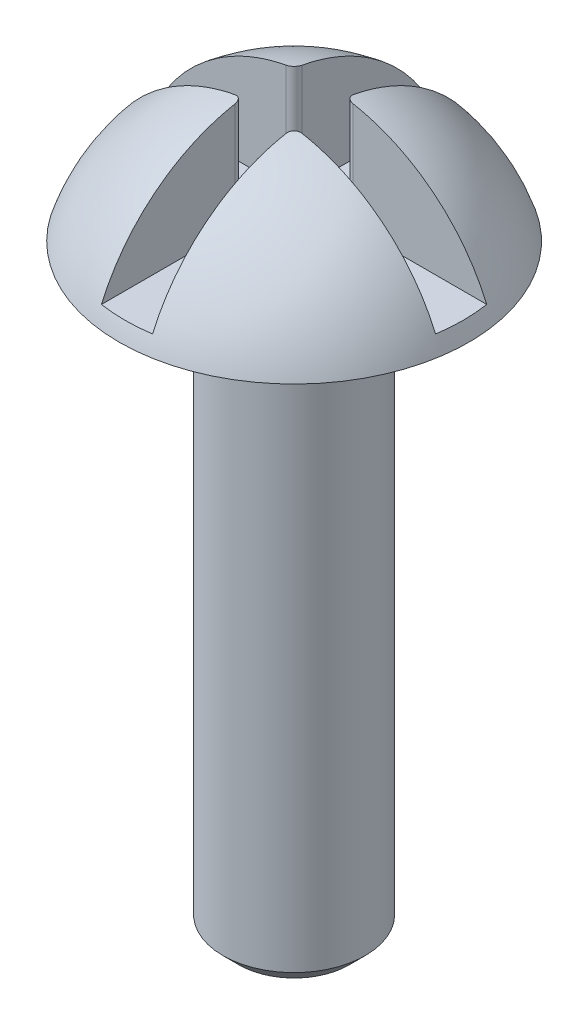
ISO-10303-21;
HEADER;
FILE_DESCRIPTION(('STEP AP214'),'2;1');
FILE_NAME('part.step','',(''),(''),'','','');
FILE_SCHEMA(('AUTOMOTIVE_DESIGN { 1 0 10303 214 1 1 1 1 }'));
ENDSEC;
DATA;
#1=APPLICATION_CONTEXT('core data for automotive mechanical design processes');
#2=APPLICATION_PROTOCOL_DEFINITION('international standard','automotive_design',2000,#1);
#3=PRODUCT_CONTEXT('',#1,'mechanical');
#4=PRODUCT('Part','Part','',(#3));
#5=PRODUCT_RELATED_PRODUCT_CATEGORY('part','',(#4));
#6=PRODUCT_DEFINITION_FORMATION('','',#4);
#7=PRODUCT_DEFINITION_CONTEXT('part definition',#1,'design');
#8=PRODUCT_DEFINITION('design','',#6,#7);
#9=PRODUCT_DEFINITION_SHAPE('','',#8);
#10=(LENGTH_UNIT() NAMED_UNIT(*) SI_UNIT(.MILLI.,.METRE.));
#11=(NAMED_UNIT(*) PLANE_ANGLE_UNIT() SI_UNIT($,.RADIAN.));
#12=(NAMED_UNIT(*) SI_UNIT($,.STERADIAN.) SOLID_ANGLE_UNIT());
#13=UNCERTAINTY_MEASURE_WITH_UNIT(LENGTH_MEASURE(1.E-05),#10,'distance_accuracy_value','');
#14=(GEOMETRIC_REPRESENTATION_CONTEXT(3) GLOBAL_UNCERTAINTY_ASSIGNED_CONTEXT((#13)) GLOBAL_UNIT_ASSIGNED_CONTEXT((#10,
#11,#12)) REPRESENTATION_CONTEXT('',''));
#15=CARTESIAN_POINT('',(0.,0.,0.));
#16=DIRECTION('',(0.,0.,1.));
#17=DIRECTION('',(1.,0.,0.));
#18=AXIS2_PLACEMENT_3D('',#15,#16,#17);
#19=CARTESIAN_POINT('',(0.,-0.8874521875,0.));
#20=DIRECTION('',(0.,1.,0.));
#21=DIRECTION('',(0.,0.,-1.));
#22=AXIS2_PLACEMENT_3D('',#19,#20,#21);
#23=SPHERICAL_SURFACE('',#22,2.9194521875);
#24=CARTESIAN_POINT('',(0.,0.,0.));
#25=DIRECTION('',(0.,1.,0.));
#26=DIRECTION('',(0.,0.,1.));
#27=AXIS2_PLACEMENT_3D('',#24,#25,#26);
#28=CIRCLE('',#27,2.7813);
#29=CARTESIAN_POINT('',(0.,0.,2.7813));
#30=VERTEX_POINT('',#29);
#31=EDGE_CURVE('E141',#30,#30,#28,.T.);
#32=ORIENTED_EDGE('',*,*,#31,.T.);
#33=EDGE_LOOP('',(#32));
#34=FACE_BOUND('',#33,.T.);
#35=CARTESIAN_POINT('',(0.,-0.8874521875,0.4064));
#36=DIRECTION('',(0.,0.,-1.));
#37=DIRECTION('',(-1.,0.,0.));
#38=AXIS2_PLACEMENT_3D('',#35,#36,#37);
#39=CIRCLE('',#38,2.89102751891063);
#40=CARTESIAN_POINT('',(0.5334,1.95394263812676,0.4064));
#41=VERTEX_POINT('',#40);
#42=CARTESIAN_POINT('',(2.65614890748806,0.254,0.4064));
#43=VERTEX_POINT('',#42);
#44=EDGE_CURVE('E130',#41,#43,#39,.T.);
#45=ORIENTED_EDGE('',*,*,#44,.F.);
#46=CARTESIAN_POINT('',(0.5334,1.95394263812676,0.4064));
#47=CARTESIAN_POINT('',(0.526429818175139,1.95525229722327,0.406393656141367));
#48=CARTESIAN_POINT('',(0.519437835446964,1.95645509605652,0.406973594128656));
#49=CARTESIAN_POINT('',(0.505606235655716,1.95861553609979,0.4092821138562));
#50=CARTESIAN_POINT('',(0.498766646008504,1.95957313351748,0.411010900579816));
#51=CARTESIAN_POINT('',(0.485430256638656,1.96121224794666,0.41559599247346));
#52=CARTESIAN_POINT('',(0.478933887553856,1.96189342496913,0.418453677685523));
#53=CARTESIAN_POINT('',(0.466492205552098,1.96295524916309,0.425222198161783));
#54=CARTESIAN_POINT('',(0.460546593915372,1.96333606009944,0.429132457981764));
#55=CARTESIAN_POINT('',(0.449486927445761,1.96378044826487,0.437816878775803));
#56=CARTESIAN_POINT('',(0.444359620352882,1.96384971613864,0.442573878351436));
#57=CARTESIAN_POINT('',(0.434956144691681,1.96368421809729,0.45286200159492));
#58=CARTESIAN_POINT('',(0.430680051299517,1.96344942534235,0.458393193563276));
#59=CARTESIAN_POINT('',(0.423132521628344,1.96268707574739,0.470014757316168));
#60=CARTESIAN_POINT('',(0.419852633333455,1.96216209494732,0.47609982079818));
#61=CARTESIAN_POINT('',(0.414329348110143,1.9608378635328,0.488695976120198));
#62=CARTESIAN_POINT('',(0.412085879160701,1.96003863198283,0.495207038321548));
#63=CARTESIAN_POINT('',(0.409056788031691,1.95839420105987,0.507011870443117));
#64=CARTESIAN_POINT('',(0.4080593321899,1.95759753777458,0.51225938370448));
#65=CARTESIAN_POINT('',(0.406730640863846,1.95586838945596,0.522808202103091));
#66=CARTESIAN_POINT('',(0.406398441009912,1.9549361031323,0.528109418162684));
#67=CARTESIAN_POINT('',(0.406399999999747,1.95394263812875,0.533400000000212));
#68=B_SPLINE_CURVE_WITH_KNOTS('',3,(#46,#47,#48,#49,#50,#51,#52,#53,#54,#55,#56,#57,#58,#59,#60,
#61,#62,#63,#64,#65,#66,#67),.UNSPECIFIED.,.F.,.F.,(4,2,2,2,2,2,2,2,2,2,4),(0.,
0.0212545383082465,0.0425128699765531,0.0637972700923001,0.0850700575426839,0.105952655327571,
0.126837096571577,0.147539053766297,0.168239572160783,0.184399511119075,0.200536007268686),.UNSPECIFIED.);
#69=CARTESIAN_POINT('',(0.4064,1.95394263812676,0.533399999999999));
#70=VERTEX_POINT('',#69);
#71=EDGE_CURVE('E199',#41,#70,#68,.T.);
#72=ORIENTED_EDGE('',*,*,#71,.T.);
#73=CARTESIAN_POINT('',(0.4064,-0.8874521875,0.));
#74=DIRECTION('',(-1.,0.,0.));
#75=DIRECTION('',(0.,0.,1.));
#76=AXIS2_PLACEMENT_3D('',#73,#74,#75);
#77=CIRCLE('',#76,2.89102751891063);
#78=CARTESIAN_POINT('',(0.4064,0.254,2.65614890748806));
#79=VERTEX_POINT('',#78);
#80=EDGE_CURVE('E157',#79,#70,#77,.T.);
#81=ORIENTED_EDGE('',*,*,#80,.F.);
#82=CARTESIAN_POINT('',(0.,0.254,0.));
#83=DIRECTION('',(0.,-1.,0.));
#84=DIRECTION('',(0.,0.,-1.));
#85=AXIS2_PLACEMENT_3D('',#82,#83,#84);
#86=CIRCLE('',#85,2.68705935527111);
#87=CARTESIAN_POINT('',(-0.4064,0.254,2.65614890748806));
#88=VERTEX_POINT('',#87);
#89=EDGE_CURVE('E133',#79,#88,#86,.T.);
#90=ORIENTED_EDGE('',*,*,#89,.T.);
#91=CARTESIAN_POINT('',(-0.4064,-0.8874521875,0.));
#92=DIRECTION('',(1.,0.,0.));
#93=DIRECTION('',(0.,0.,-1.));
#94=AXIS2_PLACEMENT_3D('',#91,#92,#93);
#95=CIRCLE('',#94,2.89102751891063);
#96=CARTESIAN_POINT('',(-0.4064,1.95394263812676,0.5334));
#97=VERTEX_POINT('',#96);
#98=EDGE_CURVE('E163',#97,#88,#95,.T.);
#99=ORIENTED_EDGE('',*,*,#98,.F.);
#100=CARTESIAN_POINT('',(-0.4064,1.95394263812676,0.5334));
#101=CARTESIAN_POINT('',(-0.406393656141367,1.95525229722327,0.526429818175139));
#102=CARTESIAN_POINT('',(-0.406973594128656,1.95645509605652,0.519437835446964));
#103=CARTESIAN_POINT('',(-0.4092821138562,1.95861553609979,0.505606235655716));
#104=CARTESIAN_POINT('',(-0.411010900579817,1.95957313351748,0.498766646008504));
#105=CARTESIAN_POINT('',(-0.41559599247346,1.96121224794666,0.485430256638656));
#106=CARTESIAN_POINT('',(-0.418453677685524,1.96189342496913,0.478933887553856));
#107=CARTESIAN_POINT('',(-0.425222198161783,1.96295524916309,0.466492205552098));
#108=CARTESIAN_POINT('',(-0.429132457981765,1.96333606009944,0.460546593915372));
#109=CARTESIAN_POINT('',(-0.437816878775803,1.96378044826487,0.449486927445761));
#110=CARTESIAN_POINT('',(-0.442573878351437,1.96384971613864,0.444359620352882));
#111=CARTESIAN_POINT('',(-0.452862001594921,1.96368421809729,0.434956144691681));
#112=CARTESIAN_POINT('',(-0.458393193563277,1.96344942534234,0.430680051299517));
#113=CARTESIAN_POINT('',(-0.470014757316169,1.96268707574739,0.423132521628344));
#114=CARTESIAN_POINT('',(-0.47609982079818,1.96216209494732,0.419852633333455));
#115=CARTESIAN_POINT('',(-0.488695976120198,1.9608378635328,0.414329348110143));
#116=CARTESIAN_POINT('',(-0.495207038321549,1.96003863198283,0.4120858791607));
#117=CARTESIAN_POINT('',(-0.507011870443117,1.95839420105987,0.409056788031691));
#118=CARTESIAN_POINT('',(-0.51225938370448,1.95759753777458,0.4080593321899));
#119=CARTESIAN_POINT('',(-0.522808202103091,1.95586838945596,0.406730640863846));
#120=CARTESIAN_POINT('',(-0.528109418162684,1.9549361031323,0.406398441009912));
#121=CARTESIAN_POINT('',(-0.533400000000212,1.95394263812875,0.406399999999747));
#122=B_SPLINE_CURVE_WITH_KNOTS('',3,(#100,#101,#102,#103,#104,#105,#106,#107,#108,#109,#110,
#111,#112,#113,#114,#115,#116,#117,#118,#119,#120,#121),.UNSPECIFIED.,.F.,.F.,(4,2,2,2,2,2,2,2,
2,2,4),(0.,0.0212545383082466,0.0425128699765532,0.0637972700923003,0.0850700575426841,
0.105952655327572,0.126837096571577,0.147539053766297,0.168239572160783,0.184399511119075,
0.200536007268686),.UNSPECIFIED.);
#123=CARTESIAN_POINT('',(-0.5334,1.95394263812676,0.4064));
#124=VERTEX_POINT('',#123);
#125=EDGE_CURVE('E177',#97,#124,#122,.T.);
#126=ORIENTED_EDGE('',*,*,#125,.T.);
#127=CARTESIAN_POINT('',(0.,-0.8874521875,0.4064));
#128=DIRECTION('',(0.,0.,-1.));
#129=DIRECTION('',(-1.,0.,0.));
#130=AXIS2_PLACEMENT_3D('',#127,#128,#129);
#131=CIRCLE('',#130,2.89102751891063);
#132=CARTESIAN_POINT('',(-2.65614890748806,0.254,0.4064));
#133=VERTEX_POINT('',#132);
#134=EDGE_CURVE('E160',#133,#124,#131,.T.);
#135=ORIENTED_EDGE('',*,*,#134,.F.);
#136=CARTESIAN_POINT('',(-2.65614890748806,0.254,-0.4064));
#137=VERTEX_POINT('',#136);
#138=EDGE_CURVE('E131',#133,#137,#86,.T.);
#139=ORIENTED_EDGE('',*,*,#138,.T.);
#140=CARTESIAN_POINT('',(0.,-0.8874521875,-0.406399999999999));
#141=DIRECTION('',(0.,0.,1.));
#142=DIRECTION('',(1.,0.,0.));
#143=AXIS2_PLACEMENT_3D('',#140,#141,#142);
#144=CIRCLE('',#143,2.89102751891063);
#145=CARTESIAN_POINT('',(-0.5334,1.95394263812676,-0.406399999999999));
#146=VERTEX_POINT('',#145);
#147=EDGE_CURVE('E146',#146,#137,#144,.T.);
#148=ORIENTED_EDGE('',*,*,#147,.F.);
#149=CARTESIAN_POINT('',(-0.5334,1.95394263812676,-0.406399999999999));
#150=CARTESIAN_POINT('',(-0.526429818175138,1.95525229722327,-0.406393656141367));
#151=CARTESIAN_POINT('',(-0.519437835446964,1.95645509605652,-0.406973594128656));
#152=CARTESIAN_POINT('',(-0.505606235655716,1.95861553609979,-0.4092821138562));
#153=CARTESIAN_POINT('',(-0.498766646008504,1.95957313351748,-0.411010900579816));
#154=CARTESIAN_POINT('',(-0.485430256638656,1.96121224794666,-0.41559599247346));
#155=CARTESIAN_POINT('',(-0.478933887553856,1.96189342496913,-0.418453677685523));
#156=CARTESIAN_POINT('',(-0.466492205552098,1.96295524916309,-0.425222198161783));
#157=CARTESIAN_POINT('',(-0.460546593915372,1.96333606009944,-0.429132457981764));
#158=CARTESIAN_POINT('',(-0.449486927445761,1.96378044826487,-0.437816878775803));
#159=CARTESIAN_POINT('',(-0.444359620352882,1.96384971613864,-0.442573878351436));
#160=CARTESIAN_POINT('',(-0.434956144691681,1.96368421809729,-0.45286200159492));
#161=CARTESIAN_POINT('',(-0.430680051299517,1.96344942534235,-0.458393193563276));
#162=CARTESIAN_POINT('',(-0.423132521628344,1.96268707574739,-0.470014757316168));
#163=CARTESIAN_POINT('',(-0.419852633333455,1.96216209494732,-0.47609982079818));
#164=CARTESIAN_POINT('',(-0.414329348110143,1.9608378635328,-0.488695976120198));
#165=CARTESIAN_POINT('',(-0.412085879160701,1.96003863198283,-0.495207038321548));
#166=CARTESIAN_POINT('',(-0.409056788031691,1.95839420105987,-0.507011870443117));
#167=CARTESIAN_POINT('',(-0.4080593321899,1.95759753777458,-0.51225938370448));
#168=CARTESIAN_POINT('',(-0.406730640863846,1.95586838945596,-0.522808202103091));
#169=CARTESIAN_POINT('',(-0.406398441009912,1.9549361031323,-0.528109418162684));
#170=CARTESIAN_POINT('',(-0.406399999999747,1.95394263812875,-0.533400000000212));
#171=B_SPLINE_CURVE_WITH_KNOTS('',3,(#149,#150,#151,#152,#153,#154,#155,#156,#157,#158,#159,
#160,#161,#162,#163,#164,#165,#166,#167,#168,#169,#170),.UNSPECIFIED.,.F.,.F.,(4,2,2,2,2,2,2,2,
2,2,4),(0.,0.0212545383082464,0.0425128699765531,0.0637972700923001,0.0850700575426839,
0.105952655327571,0.126837096571576,0.147539053766297,0.168239572160783,0.184399511119075,
0.200536007268686),.UNSPECIFIED.);
#172=CARTESIAN_POINT('',(-0.4064,1.95394263812676,-0.533399999999999));
#173=VERTEX_POINT('',#172);
#174=EDGE_CURVE('E171',#146,#173,#171,.T.);
#175=ORIENTED_EDGE('',*,*,#174,.T.);
#176=CARTESIAN_POINT('',(-0.4064,-0.8874521875,0.));
#177=DIRECTION('',(1.,0.,0.));
#178=DIRECTION('',(0.,0.,-1.));
#179=AXIS2_PLACEMENT_3D('',#176,#177,#178);
#180=CIRCLE('',#179,2.89102751891063);
#181=CARTESIAN_POINT('',(-0.4064,0.254,-2.65614890748806));
#182=VERTEX_POINT('',#181);
#183=EDGE_CURVE('E152',#182,#173,#180,.T.);
#184=ORIENTED_EDGE('',*,*,#183,.F.);
#185=CARTESIAN_POINT('',(0.4064,0.254,-2.65614890748806));
#186=VERTEX_POINT('',#185);
#187=EDGE_CURVE('E255',#182,#186,#86,.T.);
#188=ORIENTED_EDGE('',*,*,#187,.T.);
#189=CARTESIAN_POINT('',(0.4064,-0.8874521875,0.));
#190=DIRECTION('',(-1.,0.,0.));
#191=DIRECTION('',(0.,0.,1.));
#192=AXIS2_PLACEMENT_3D('',#189,#190,#191);
#193=CIRCLE('',#192,2.89102751891063);
#194=CARTESIAN_POINT('',(0.4064,1.95394263812676,-0.5334));
#195=VERTEX_POINT('',#194);
#196=EDGE_CURVE('E147',#195,#186,#193,.T.);
#197=ORIENTED_EDGE('',*,*,#196,.F.);
#198=CARTESIAN_POINT('',(0.4064,1.95394263812676,-0.5334));
#199=CARTESIAN_POINT('',(0.406393656141368,1.95525229722327,-0.526429818175138));
#200=CARTESIAN_POINT('',(0.406973594128657,1.95645509605652,-0.519437835446964));
#201=CARTESIAN_POINT('',(0.409282113856201,1.95861553609979,-0.505606235655716));
#202=CARTESIAN_POINT('',(0.411010900579817,1.95957313351748,-0.498766646008504));
#203=CARTESIAN_POINT('',(0.41559599247346,1.96121224794666,-0.485430256638656));
#204=CARTESIAN_POINT('',(0.418453677685524,1.96189342496913,-0.478933887553856));
#205=CARTESIAN_POINT('',(0.425222198161783,1.96295524916309,-0.466492205552098));
#206=CARTESIAN_POINT('',(0.429132457981765,1.96333606009944,-0.460546593915372));
#207=CARTESIAN_POINT('',(0.437816878775804,1.96378044826487,-0.449486927445761));
#208=CARTESIAN_POINT('',(0.442573878351437,1.96384971613864,-0.444359620352882));
#209=CARTESIAN_POINT('',(0.452862001594921,1.96368421809729,-0.434956144691681));
#210=CARTESIAN_POINT('',(0.458393193563277,1.96344942534234,-0.430680051299517));
#211=CARTESIAN_POINT('',(0.470014757316169,1.96268707574739,-0.423132521628343));
#212=CARTESIAN_POINT('',(0.47609982079818,1.96216209494732,-0.419852633333455));
#213=CARTESIAN_POINT('',(0.488695976120199,1.9608378635328,-0.414329348110143));
#214=CARTESIAN_POINT('',(0.495207038321549,1.96003863198283,-0.4120858791607));
#215=CARTESIAN_POINT('',(0.507011870443118,1.95839420105987,-0.409056788031691));
#216=CARTESIAN_POINT('',(0.512259383704481,1.95759753777458,-0.4080593321899));
#217=CARTESIAN_POINT('',(0.522808202103091,1.95586838945596,-0.406730640863846));
#218=CARTESIAN_POINT('',(0.528109418162684,1.9549361031323,-0.406398441009912));
#219=CARTESIAN_POINT('',(0.533400000000213,1.95394263812875,-0.406399999999747));
#220=B_SPLINE_CURVE_WITH_KNOTS('',3,(#198,#199,#200,#201,#202,#203,#204,#205,#206,#207,#208,
#209,#210,#211,#212,#213,#214,#215,#216,#217,#218,#219),.UNSPECIFIED.,.F.,.F.,(4,2,2,2,2,2,2,2,
2,2,4),(0.,0.0212545383082464,0.0425128699765531,0.0637972700923001,0.085070057542684,
0.105952655327572,0.126837096571577,0.147539053766297,0.168239572160783,0.184399511119075,
0.200536007268686),.UNSPECIFIED.);
#221=CARTESIAN_POINT('',(0.5334,1.95394263812676,-0.4064));
#222=VERTEX_POINT('',#221);
#223=EDGE_CURVE('E145',#195,#222,#220,.T.);
#224=ORIENTED_EDGE('',*,*,#223,.T.);
#225=CARTESIAN_POINT('',(0.,-0.8874521875,-0.4064));
#226=DIRECTION('',(0.,0.,1.));
#227=DIRECTION('',(1.,0.,0.));
#228=AXIS2_PLACEMENT_3D('',#225,#226,#227);
#229=CIRCLE('',#228,2.89102751891063);
#230=CARTESIAN_POINT('',(2.65614890748806,0.254,-0.4064));
#231=VERTEX_POINT('',#230);
#232=EDGE_CURVE('E138',#231,#222,#229,.T.);
#233=ORIENTED_EDGE('',*,*,#232,.F.);
#234=EDGE_CURVE('E120',#231,#43,#86,.T.);
#235=ORIENTED_EDGE('',*,*,#234,.T.);
#236=EDGE_LOOP('',(#45,#72,#81,#90,#99,#126,#135,#139,#148,#175,#184,#188,#197,#224,#233,#235));
#237=FACE_BOUND('',#236,.T.);
#238=ADVANCED_FACE('F33',(#34,#237),#23,.T.);
#239=CARTESIAN_POINT('',(0.,0.,0.));
#240=DIRECTION('',(0.,1.,0.));
#241=DIRECTION('',(0.,0.,1.));
#242=AXIS2_PLACEMENT_3D('',#239,#240,#241);
#243=PLANE('',#242);
#244=ORIENTED_EDGE('',*,*,#31,.F.);
#245=EDGE_LOOP('',(#244));
#246=FACE_BOUND('',#245,.T.);
#247=CARTESIAN_POINT('',(0.,0.,0.));
#248=DIRECTION('',(0.,1.,0.));
#249=DIRECTION('',(0.,0.,1.));
#250=AXIS2_PLACEMENT_3D('',#247,#248,#249);
#251=CIRCLE('',#250,1.1303);
#252=CARTESIAN_POINT('',(0.,0.,1.1303));
#253=VERTEX_POINT('',#252);
#254=EDGE_CURVE('E247',#253,#253,#251,.F.);
#255=ORIENTED_EDGE('',*,*,#254,.F.);
#256=EDGE_LOOP('',(#255));
#257=FACE_BOUND('',#256,.T.);
#258=ADVANCED_FACE('F186',(#246,#257),#243,.F.);
#259=CARTESIAN_POINT('',(0.,-9.525,0.));
#260=DIRECTION('',(0.,1.,0.));
#261=DIRECTION('',(0.,0.,1.));
#262=AXIS2_PLACEMENT_3D('',#259,#260,#261);
#263=CYLINDRICAL_SURFACE('',#262,1.1303);
#264=CARTESIAN_POINT('',(0.,-9.27100000000001,0.));
#265=DIRECTION('',(0.,-1.,0.));
#266=DIRECTION('',(0.,0.,-1.));
#267=AXIS2_PLACEMENT_3D('',#264,#265,#266);
#268=CIRCLE('',#267,1.1303);
#269=CARTESIAN_POINT('',(0.,-9.27100000000001,1.1303));
#270=VERTEX_POINT('',#269);
#271=EDGE_CURVE('E253',#270,#270,#268,.F.);
#272=CARTESIAN_POINT('',(0.,-9.27100000000001,1.1303));
#273=CARTESIAN_POINT('',(0.,-9.17442708333334,1.1303));
#274=CARTESIAN_POINT('',(0.,-9.07785416666667,1.1303));
#275=CARTESIAN_POINT('',(0.,-8.88470833333334,1.1303));
#276=CARTESIAN_POINT('',(0.,-8.78813541666667,1.1303));
#277=CARTESIAN_POINT('',(0.,-8.59498958333334,1.1303));
#278=CARTESIAN_POINT('',(0.,-8.49841666666667,1.1303));
#279=CARTESIAN_POINT('',(0.,-8.30527083333334,1.1303));
#280=CARTESIAN_POINT('',(0.,-8.20869791666667,1.1303));
#281=CARTESIAN_POINT('',(0.,-8.01555208333334,1.1303));
#282=CARTESIAN_POINT('',(0.,-7.91897916666667,1.1303));
#283=CARTESIAN_POINT('',(0.,-7.72583333333334,1.1303));
#284=CARTESIAN_POINT('',(0.,-7.62926041666667,1.1303));
#285=CARTESIAN_POINT('',(0.,-7.43611458333334,1.1303));
#286=CARTESIAN_POINT('',(0.,-7.33954166666667,1.1303));
#287=CARTESIAN_POINT('',(0.,-7.14639583333334,1.1303));
#288=CARTESIAN_POINT('',(0.,-7.04982291666667,1.1303));
#289=CARTESIAN_POINT('',(0.,-6.85667708333334,1.1303));
#290=CARTESIAN_POINT('',(0.,-6.76010416666667,1.1303));
#291=CARTESIAN_POINT('',(0.,-6.56695833333334,1.1303));
#292=CARTESIAN_POINT('',(0.,-6.47038541666667,1.1303));
#293=CARTESIAN_POINT('',(0.,-6.27723958333334,1.1303));
#294=CARTESIAN_POINT('',(0.,-6.18066666666667,1.1303));
#295=CARTESIAN_POINT('',(0.,-5.98752083333334,1.1303));
#296=CARTESIAN_POINT('',(0.,-5.89094791666667,1.1303));
#297=CARTESIAN_POINT('',(0.,-5.69780208333334,1.1303));
#298=CARTESIAN_POINT('',(0.,-5.60122916666667,1.1303));
#299=CARTESIAN_POINT('',(0.,-5.40808333333334,1.1303));
#300=CARTESIAN_POINT('',(0.,-5.31151041666667,1.1303));
#301=CARTESIAN_POINT('',(0.,-5.11836458333334,1.1303));
#302=CARTESIAN_POINT('',(0.,-5.02179166666667,1.1303));
#303=CARTESIAN_POINT('',(0.,-4.82864583333334,1.1303));
#304=CARTESIAN_POINT('',(0.,-4.73207291666667,1.1303));
#305=CARTESIAN_POINT('',(0.,-4.53892708333334,1.1303));
#306=CARTESIAN_POINT('',(0.,-4.44235416666667,1.1303));
#307=CARTESIAN_POINT('',(0.,-4.24920833333334,1.1303));
#308=CARTESIAN_POINT('',(0.,-4.15263541666667,1.1303));
#309=CARTESIAN_POINT('',(0.,-3.95948958333334,1.1303));
#310=CARTESIAN_POINT('',(0.,-3.86291666666667,1.1303));
#311=CARTESIAN_POINT('',(0.,-3.66977083333334,1.1303));
#312=CARTESIAN_POINT('',(0.,-3.57319791666667,1.1303));
#313=CARTESIAN_POINT('',(0.,-3.38005208333334,1.1303));
#314=CARTESIAN_POINT('',(0.,-3.28347916666667,1.1303));
#315=CARTESIAN_POINT('',(0.,-3.09033333333334,1.1303));
#316=CARTESIAN_POINT('',(0.,-2.99376041666667,1.1303));
#317=CARTESIAN_POINT('',(0.,-2.80061458333334,1.1303));
#318=CARTESIAN_POINT('',(0.,-2.70404166666667,1.1303));
#319=CARTESIAN_POINT('',(0.,-2.51089583333334,1.1303));
#320=CARTESIAN_POINT('',(0.,-2.41432291666667,1.1303));
#321=CARTESIAN_POINT('',(0.,-2.22117708333334,1.1303));
#322=CARTESIAN_POINT('',(0.,-2.12460416666667,1.1303));
#323=CARTESIAN_POINT('',(0.,-1.93145833333334,1.1303));
#324=CARTESIAN_POINT('',(0.,-1.83488541666667,1.1303));
#325=CARTESIAN_POINT('',(0.,-1.64173958333334,1.1303));
#326=CARTESIAN_POINT('',(0.,-1.54516666666667,1.1303));
#327=CARTESIAN_POINT('',(0.,-1.35202083333333,1.1303));
#328=CARTESIAN_POINT('',(0.,-1.25544791666667,1.1303));
#329=CARTESIAN_POINT('',(0.,-1.06230208333333,1.1303));
#330=CARTESIAN_POINT('',(0.,-0.965729166666667,1.1303));
#331=CARTESIAN_POINT('',(0.,-0.772583333333334,1.1303));
#332=CARTESIAN_POINT('',(0.,-0.676010416666667,1.1303));
#333=CARTESIAN_POINT('',(0.,-0.482864583333334,1.1303));
#334=CARTESIAN_POINT('',(0.,-0.386291666666667,1.1303));
#335=CARTESIAN_POINT('',(0.,-0.193145833333334,1.1303));
#336=CARTESIAN_POINT('',(0.,-0.096572916666667,1.1303));
#337=CARTESIAN_POINT('',(0.,0.,1.1303));
#338=B_SPLINE_CURVE_WITH_KNOTS('',3,(#272,#273,#274,#275,#276,#277,#278,#279,#280,#281,#282,
#283,#284,#285,#286,#287,#288,#289,#290,#291,#292,#293,#294,#295,#296,#297,#298,#299,#300,#301,
#302,#303,#304,#305,#306,#307,#308,#309,#310,#311,#312,#313,#314,#315,#316,#317,#318,#319,#320,
#321,#322,#323,#324,#325,#326,#327,#328,#329,#330,#331,#332,#333,#334,#335,#336,#337),
.UNSPECIFIED.,.F.,.F.,(4,2,2,2,2,2,2,2,2,2,2,2,2,2,2,2,2,2,2,2,2,2,2,2,2,2,2,2,2,2,2,2,4),(0.,
0.289718749999999,0.5794375,0.869156249999999,1.158875,1.44859375,1.7383125,2.02803125,2.31775,
2.60746875,2.8971875,3.18690625,3.476625,3.76634375,4.0560625,4.34578125,4.6355,4.92521875,
5.2149375,5.50465625,5.794375,6.08409375,6.3738125,6.66353125,6.95325,7.24296875,
7.53268750000001,7.82240625000001,8.11212500000001,8.40184375000001,8.69156250000001,
8.98128125000001,9.27100000000001),.UNSPECIFIED.);
#339=EDGE_CURVE('BSEAM188',#270,#253,#338,.T.);
#340=ORIENTED_EDGE('',*,*,#271,.T.);
#341=ORIENTED_EDGE('',*,*,#254,.T.);
#342=ORIENTED_EDGE('',*,*,#339,.T.);
#343=ORIENTED_EDGE('',*,*,#339,.F.);
#344=EDGE_LOOP('',(#340,#342,#341,#343));
#345=FACE_BOUND('',#344,.T.);
#346=ADVANCED_FACE('F188',(#345),#263,.T.);
#347=CARTESIAN_POINT('',(0.,-9.525,0.));
#348=DIRECTION('',(0.,-1.,0.));
#349=DIRECTION('',(0.,0.,-1.));
#350=AXIS2_PLACEMENT_3D('',#347,#348,#349);
#351=PLANE('',#350);
#352=CARTESIAN_POINT('',(0.,-9.525,0.));
#353=DIRECTION('',(0.,-1.,0.));
#354=DIRECTION('',(0.,0.,-1.));
#355=AXIS2_PLACEMENT_3D('',#352,#353,#354);
#356=CIRCLE('',#355,0.876300000000007);
#357=CARTESIAN_POINT('',(0.,-9.525,-0.876300000000008));
#358=VERTEX_POINT('',#357);
#359=EDGE_CURVE('E250',#358,#358,#356,.T.);
#360=ORIENTED_EDGE('',*,*,#359,.T.);
#361=EDGE_LOOP('',(#360));
#362=FACE_BOUND('',#361,.T.);
#363=ADVANCED_FACE('F303',(#362),#351,.T.);
#364=CARTESIAN_POINT('',(0.,-9.525,0.));
#365=DIRECTION('',(0.,1.,0.));
#366=DIRECTION('',(0.,0.,1.));
#367=AXIS2_PLACEMENT_3D('',#364,#365,#366);
#368=CONICAL_SURFACE('',#367,0.876300000000007,0.785398163397448);
#369=ORIENTED_EDGE('',*,*,#271,.F.);
#370=EDGE_LOOP('',(#369));
#371=FACE_BOUND('',#370,.T.);
#372=ORIENTED_EDGE('',*,*,#359,.F.);
#373=EDGE_LOOP('',(#372));
#374=FACE_BOUND('',#373,.T.);
#375=ADVANCED_FACE('F295',(#371,#374),#368,.T.);
#376=CARTESIAN_POINT('',(0.4064,2.032,-0.4064));
#377=DIRECTION('',(-1.,0.,0.));
#378=DIRECTION('',(0.,0.,1.));
#379=AXIS2_PLACEMENT_3D('',#376,#377,#378);
#380=PLANE('',#379);
#381=DIRECTION('',(0.,0.,-1.));
#382=VECTOR('',#381,1.);
#383=CARTESIAN_POINT('',(0.4064,0.254,-0.4064));
#384=LINE('',#383,#382);
#385=CARTESIAN_POINT('',(0.4064,0.254,-0.5334));
#386=VERTEX_POINT('',#385);
#387=EDGE_CURVE('E292',#386,#186,#384,.T.);
#388=ORIENTED_EDGE('',*,*,#387,.F.);
#389=DIRECTION('',(0.,-1.,0.));
#390=VECTOR('',#389,1.);
#391=CARTESIAN_POINT('',(0.4064,2.032,-0.5334));
#392=LINE('',#391,#390);
#393=EDGE_CURVE('E286',#386,#195,#392,.F.);
#394=ORIENTED_EDGE('',*,*,#393,.T.);
#395=ORIENTED_EDGE('',*,*,#196,.T.);
#396=EDGE_LOOP('',(#388,#394,#395));
#397=FACE_BOUND('',#396,.T.);
#398=ADVANCED_FACE('F291',(#397),#380,.T.);
#399=CARTESIAN_POINT('',(-0.4064,2.032,-0.406399999999999));
#400=DIRECTION('',(1.,0.,0.));
#401=DIRECTION('',(0.,0.,-1.));
#402=AXIS2_PLACEMENT_3D('',#399,#400,#401);
#403=PLANE('',#402);
#404=ORIENTED_EDGE('',*,*,#183,.T.);
#405=DIRECTION('',(0.,-1.,0.));
#406=VECTOR('',#405,1.);
#407=CARTESIAN_POINT('',(-0.4064,2.032,-0.533399999999999));
#408=LINE('',#407,#406);
#409=CARTESIAN_POINT('',(-0.4064,0.254,-0.533399999999999));
#410=VERTEX_POINT('',#409);
#411=EDGE_CURVE('E262',#173,#410,#408,.T.);
#412=ORIENTED_EDGE('',*,*,#411,.T.);
#413=DIRECTION('',(0.,0.,1.));
#414=VECTOR('',#413,1.);
#415=CARTESIAN_POINT('',(-0.4064,0.254,-0.406399999999999));
#416=LINE('',#415,#414);
#417=EDGE_CURVE('E238',#182,#410,#416,.T.);
#418=ORIENTED_EDGE('',*,*,#417,.F.);
#419=EDGE_LOOP('',(#404,#412,#418));
#420=FACE_BOUND('',#419,.T.);
#421=ADVANCED_FACE('F261',(#420),#403,.T.);
#422=CARTESIAN_POINT('',(-0.4064,2.032,-0.406399999999999));
#423=DIRECTION('',(0.,0.,1.));
#424=DIRECTION('',(1.,0.,0.));
#425=AXIS2_PLACEMENT_3D('',#422,#423,#424);
#426=PLANE('',#425);
#427=DIRECTION('',(-1.,0.,0.));
#428=VECTOR('',#427,1.);
#429=CARTESIAN_POINT('',(-0.4064,0.254,-0.406399999999999));
#430=LINE('',#429,#428);
#431=CARTESIAN_POINT('',(-0.5334,0.254,-0.406399999999999));
#432=VERTEX_POINT('',#431);
#433=EDGE_CURVE('E234',#432,#137,#430,.T.);
#434=ORIENTED_EDGE('',*,*,#433,.F.);
#435=DIRECTION('',(0.,-1.,0.));
#436=VECTOR('',#435,1.);
#437=CARTESIAN_POINT('',(-0.5334,2.032,-0.406399999999999));
#438=LINE('',#437,#436);
#439=EDGE_CURVE('E264',#432,#146,#438,.F.);
#440=ORIENTED_EDGE('',*,*,#439,.T.);
#441=ORIENTED_EDGE('',*,*,#147,.T.);
#442=EDGE_LOOP('',(#434,#440,#441));
#443=FACE_BOUND('',#442,.T.);
#444=ADVANCED_FACE('F301',(#443),#426,.T.);
#445=CARTESIAN_POINT('',(-0.4064,2.032,0.4064));
#446=DIRECTION('',(0.,0.,-1.));
#447=DIRECTION('',(-1.,0.,0.));
#448=AXIS2_PLACEMENT_3D('',#445,#446,#447);
#449=PLANE('',#448);
#450=ORIENTED_EDGE('',*,*,#134,.T.);
#451=DIRECTION('',(0.,-1.,0.));
#452=VECTOR('',#451,1.);
#453=CARTESIAN_POINT('',(-0.5334,2.032,0.4064));
#454=LINE('',#453,#452);
#455=CARTESIAN_POINT('',(-0.5334,0.254,0.4064));
#456=VERTEX_POINT('',#455);
#457=EDGE_CURVE('E223',#124,#456,#454,.T.);
#458=ORIENTED_EDGE('',*,*,#457,.T.);
#459=DIRECTION('',(1.,0.,0.));
#460=VECTOR('',#459,1.);
#461=CARTESIAN_POINT('',(-0.4064,0.254,0.4064));
#462=LINE('',#461,#460);
#463=EDGE_CURVE('E232',#133,#456,#462,.T.);
#464=ORIENTED_EDGE('',*,*,#463,.F.);
#465=EDGE_LOOP('',(#450,#458,#464));
#466=FACE_BOUND('',#465,.T.);
#467=ADVANCED_FACE('F230',(#466),#449,.T.);
#468=CARTESIAN_POINT('',(-0.4064,2.032,2.7813));
#469=DIRECTION('',(1.,0.,0.));
#470=DIRECTION('',(0.,0.,-1.));
#471=AXIS2_PLACEMENT_3D('',#468,#469,#470);
#472=PLANE('',#471);
#473=DIRECTION('',(0.,0.,1.));
#474=VECTOR('',#473,1.);
#475=CARTESIAN_POINT('',(-0.4064,0.254,2.7813));
#476=LINE('',#475,#474);
#477=CARTESIAN_POINT('',(-0.4064,0.254,0.533400000000001));
#478=VERTEX_POINT('',#477);
#479=EDGE_CURVE('E233',#478,#88,#476,.T.);
#480=ORIENTED_EDGE('',*,*,#479,.F.);
#481=DIRECTION('',(0.,-1.,0.));
#482=VECTOR('',#481,1.);
#483=CARTESIAN_POINT('',(-0.4064,2.032,0.5334));
#484=LINE('',#483,#482);
#485=EDGE_CURVE('E221',#478,#97,#484,.F.);
#486=ORIENTED_EDGE('',*,*,#485,.T.);
#487=ORIENTED_EDGE('',*,*,#98,.T.);
#488=EDGE_LOOP('',(#480,#486,#487));
#489=FACE_BOUND('',#488,.T.);
#490=ADVANCED_FACE('F275',(#489),#472,.T.);
#491=CARTESIAN_POINT('',(0.4064,2.032,2.7813));
#492=DIRECTION('',(-1.,0.,0.));
#493=DIRECTION('',(0.,0.,1.));
#494=AXIS2_PLACEMENT_3D('',#491,#492,#493);
#495=PLANE('',#494);
#496=ORIENTED_EDGE('',*,*,#80,.T.);
#497=DIRECTION('',(0.,-1.,0.));
#498=VECTOR('',#497,1.);
#499=CARTESIAN_POINT('',(0.4064,2.032,0.533399999999999));
#500=LINE('',#499,#498);
#501=CARTESIAN_POINT('',(0.4064,0.254,0.533399999999999));
#502=VERTEX_POINT('',#501);
#503=EDGE_CURVE('E166',#70,#502,#500,.T.);
#504=ORIENTED_EDGE('',*,*,#503,.T.);
#505=DIRECTION('',(0.,0.,-1.));
#506=VECTOR('',#505,1.);
#507=CARTESIAN_POINT('',(0.4064,0.254,2.7813));
#508=LINE('',#507,#506);
#509=EDGE_CURVE('E236',#79,#502,#508,.T.);
#510=ORIENTED_EDGE('',*,*,#509,.F.);
#511=EDGE_LOOP('',(#496,#504,#510));
#512=FACE_BOUND('',#511,.T.);
#513=ADVANCED_FACE('F279',(#512),#495,.T.);
#514=CARTESIAN_POINT('',(2.7813,2.032,0.4064));
#515=DIRECTION('',(0.,0.,-1.));
#516=DIRECTION('',(-1.,0.,0.));
#517=AXIS2_PLACEMENT_3D('',#514,#515,#516);
#518=PLANE('',#517);
#519=DIRECTION('',(1.,0.,0.));
#520=VECTOR('',#519,1.);
#521=CARTESIAN_POINT('',(2.7813,0.254,0.4064));
#522=LINE('',#521,#520);
#523=CARTESIAN_POINT('',(0.5334,0.254,0.4064));
#524=VERTEX_POINT('',#523);
#525=EDGE_CURVE('E125',#524,#43,#522,.T.);
#526=ORIENTED_EDGE('',*,*,#525,.F.);
#527=DIRECTION('',(0.,-1.,0.));
#528=VECTOR('',#527,1.);
#529=CARTESIAN_POINT('',(0.5334,2.032,0.4064));
#530=LINE('',#529,#528);
#531=EDGE_CURVE('E169',#524,#41,#530,.F.);
#532=ORIENTED_EDGE('',*,*,#531,.T.);
#533=ORIENTED_EDGE('',*,*,#44,.T.);
#534=EDGE_LOOP('',(#526,#532,#533));
#535=FACE_BOUND('',#534,.T.);
#536=ADVANCED_FACE('F285',(#535),#518,.T.);
#537=CARTESIAN_POINT('',(2.7813,2.032,-0.4064));
#538=DIRECTION('',(0.,0.,1.));
#539=DIRECTION('',(1.,0.,0.));
#540=AXIS2_PLACEMENT_3D('',#537,#538,#539);
#541=PLANE('',#540);
#542=ORIENTED_EDGE('',*,*,#232,.T.);
#543=DIRECTION('',(0.,-1.,0.));
#544=VECTOR('',#543,1.);
#545=CARTESIAN_POINT('',(0.5334,2.032,-0.4064));
#546=LINE('',#545,#544);
#547=CARTESIAN_POINT('',(0.5334,0.254,-0.4064));
#548=VERTEX_POINT('',#547);
#549=EDGE_CURVE('E140',#222,#548,#546,.T.);
#550=ORIENTED_EDGE('',*,*,#549,.T.);
#551=DIRECTION('',(-1.,0.,0.));
#552=VECTOR('',#551,1.);
#553=CARTESIAN_POINT('',(2.7813,0.254,-0.4064));
#554=LINE('',#553,#552);
#555=EDGE_CURVE('E123',#231,#548,#554,.T.);
#556=ORIENTED_EDGE('',*,*,#555,.F.);
#557=EDGE_LOOP('',(#542,#550,#556));
#558=FACE_BOUND('',#557,.T.);
#559=ADVANCED_FACE('F137',(#558),#541,.T.);
#560=CARTESIAN_POINT('',(0.,0.254,0.));
#561=DIRECTION('',(0.,-1.,0.));
#562=DIRECTION('',(0.,0.,-1.));
#563=AXIS2_PLACEMENT_3D('',#560,#561,#562);
#564=PLANE('',#563);
#565=ORIENTED_EDGE('',*,*,#555,.T.);
#566=CARTESIAN_POINT('',(0.5334,0.254,-0.5334));
#567=DIRECTION('',(0.,-1.,0.));
#568=DIRECTION('',(0.,0.,-1.));
#569=AXIS2_PLACEMENT_3D('',#566,#567,#568);
#570=CIRCLE('',#569,0.127);
#571=EDGE_CURVE('E272',#548,#386,#570,.T.);
#572=ORIENTED_EDGE('',*,*,#571,.T.);
#573=ORIENTED_EDGE('',*,*,#387,.T.);
#574=ORIENTED_EDGE('',*,*,#187,.F.);
#575=ORIENTED_EDGE('',*,*,#417,.T.);
#576=CARTESIAN_POINT('',(-0.5334,0.254,-0.533399999999999));
#577=DIRECTION('',(0.,-1.,0.));
#578=DIRECTION('',(0.,0.,-1.));
#579=AXIS2_PLACEMENT_3D('',#576,#577,#578);
#580=CIRCLE('',#579,0.127);
#581=EDGE_CURVE('E11',#410,#432,#580,.T.);
#582=ORIENTED_EDGE('',*,*,#581,.T.);
#583=ORIENTED_EDGE('',*,*,#433,.T.);
#584=ORIENTED_EDGE('',*,*,#138,.F.);
#585=ORIENTED_EDGE('',*,*,#463,.T.);
#586=CARTESIAN_POINT('',(-0.5334,0.254,0.5334));
#587=DIRECTION('',(0.,-1.,0.));
#588=DIRECTION('',(0.,0.,-1.));
#589=AXIS2_PLACEMENT_3D('',#586,#587,#588);
#590=CIRCLE('',#589,0.127);
#591=EDGE_CURVE('E42',#456,#478,#590,.T.);
#592=ORIENTED_EDGE('',*,*,#591,.T.);
#593=ORIENTED_EDGE('',*,*,#479,.T.);
#594=ORIENTED_EDGE('',*,*,#89,.F.);
#595=ORIENTED_EDGE('',*,*,#509,.T.);
#596=CARTESIAN_POINT('',(0.5334,0.254,0.533399999999999));
#597=DIRECTION('',(0.,-1.,0.));
#598=DIRECTION('',(0.,0.,-1.));
#599=AXIS2_PLACEMENT_3D('',#596,#597,#598);
#600=CIRCLE('',#599,0.127);
#601=EDGE_CURVE('E266',#502,#524,#600,.T.);
#602=ORIENTED_EDGE('',*,*,#601,.T.);
#603=ORIENTED_EDGE('',*,*,#525,.T.);
#604=ORIENTED_EDGE('',*,*,#234,.F.);
#605=EDGE_LOOP('',(#565,#572,#573,#574,#575,#582,#583,#584,#585,#592,#593,#594,#595,#602,#603,#604));
#606=FACE_BOUND('',#605,.T.);
#607=ADVANCED_FACE('F122',(#606),#564,.F.);
#608=CARTESIAN_POINT('',(0.5334,2.032,0.533399999999999));
#609=DIRECTION('',(0.,-1.,0.));
#610=DIRECTION('',(0.,0.,-1.));
#611=AXIS2_PLACEMENT_3D('',#608,#609,#610);
#612=CYLINDRICAL_SURFACE('',#611,0.127);
#613=ORIENTED_EDGE('',*,*,#71,.F.);
#614=ORIENTED_EDGE('',*,*,#531,.F.);
#615=ORIENTED_EDGE('',*,*,#601,.F.);
#616=ORIENTED_EDGE('',*,*,#503,.F.);
#617=EDGE_LOOP('',(#613,#614,#615,#616));
#618=FACE_BOUND('',#617,.T.);
#619=ADVANCED_FACE('F209',(#618),#612,.T.);
#620=CARTESIAN_POINT('',(0.5334,2.032,-0.5334));
#621=DIRECTION('',(0.,-1.,0.));
#622=DIRECTION('',(0.,0.,-1.));
#623=AXIS2_PLACEMENT_3D('',#620,#621,#622);
#624=CYLINDRICAL_SURFACE('',#623,0.127);
#625=ORIENTED_EDGE('',*,*,#223,.F.);
#626=ORIENTED_EDGE('',*,*,#393,.F.);
#627=ORIENTED_EDGE('',*,*,#571,.F.);
#628=ORIENTED_EDGE('',*,*,#549,.F.);
#629=EDGE_LOOP('',(#625,#626,#627,#628));
#630=FACE_BOUND('',#629,.T.);
#631=ADVANCED_FACE('F205',(#630),#624,.T.);
#632=CARTESIAN_POINT('',(-0.5334,2.032,0.5334));
#633=DIRECTION('',(0.,-1.,0.));
#634=DIRECTION('',(0.,0.,-1.));
#635=AXIS2_PLACEMENT_3D('',#632,#633,#634);
#636=CYLINDRICAL_SURFACE('',#635,0.127);
#637=ORIENTED_EDGE('',*,*,#125,.F.);
#638=ORIENTED_EDGE('',*,*,#485,.F.);
#639=ORIENTED_EDGE('',*,*,#591,.F.);
#640=ORIENTED_EDGE('',*,*,#457,.F.);
#641=EDGE_LOOP('',(#637,#638,#639,#640));
#642=FACE_BOUND('',#641,.T.);
#643=ADVANCED_FACE('F208',(#642),#636,.T.);
#644=CARTESIAN_POINT('',(-0.5334,2.032,-0.533399999999999));
#645=DIRECTION('',(0.,-1.,0.));
#646=DIRECTION('',(0.,0.,-1.));
#647=AXIS2_PLACEMENT_3D('',#644,#645,#646);
#648=CYLINDRICAL_SURFACE('',#647,0.127);
#649=ORIENTED_EDGE('',*,*,#174,.F.);
#650=ORIENTED_EDGE('',*,*,#439,.F.);
#651=ORIENTED_EDGE('',*,*,#581,.F.);
#652=ORIENTED_EDGE('',*,*,#411,.F.);
#653=EDGE_LOOP('',(#649,#650,#651,#652));
#654=FACE_BOUND('',#653,.T.);
#655=ADVANCED_FACE('F35',(#654),#648,.T.);
#656=CLOSED_SHELL('',(#238,#258,#346,#363,#375,#398,#421,#444,#467,#490,#513,#536,#559,#607,
#619,#631,#643,#655));
#657=MANIFOLD_SOLID_BREP('B2',#656);
#658=ADVANCED_BREP_SHAPE_REPRESENTATION('',(#18,#657),#14);
#659=SHAPE_DEFINITION_REPRESENTATION(#9,#658);
ENDSEC;
END-ISO-10303-21;
